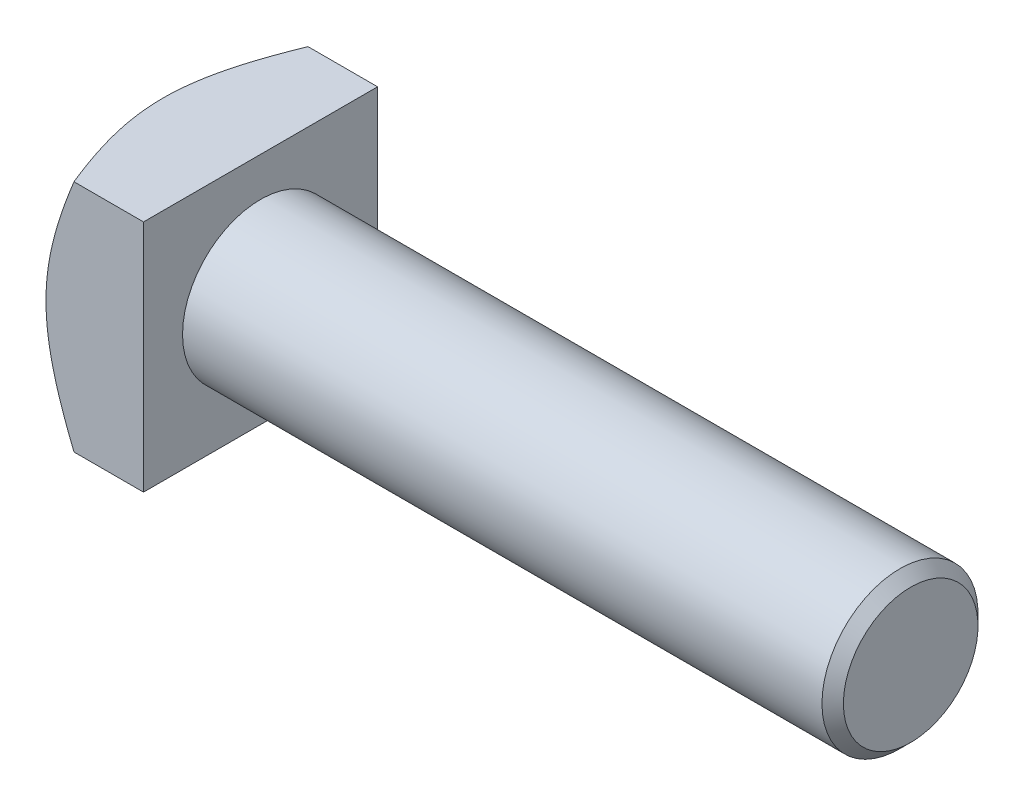
ISO-10303-21;
HEADER;
FILE_DESCRIPTION(('STEP AP214'),'2;1');
FILE_NAME('part.step','',(''),(''),'','','');
FILE_SCHEMA(('AUTOMOTIVE_DESIGN { 1 0 10303 214 1 1 1 1 }'));
ENDSEC;
DATA;
#1=APPLICATION_CONTEXT('core data for automotive mechanical design processes');
#2=APPLICATION_PROTOCOL_DEFINITION('international standard','automotive_design',2000,#1);
#3=PRODUCT_CONTEXT('',#1,'mechanical');
#4=PRODUCT('Part','Part','',(#3));
#5=PRODUCT_RELATED_PRODUCT_CATEGORY('part','',(#4));
#6=PRODUCT_DEFINITION_FORMATION('','',#4);
#7=PRODUCT_DEFINITION_CONTEXT('part definition',#1,'design');
#8=PRODUCT_DEFINITION('design','',#6,#7);
#9=PRODUCT_DEFINITION_SHAPE('','',#8);
#10=(LENGTH_UNIT() NAMED_UNIT(*) SI_UNIT(.MILLI.,.METRE.));
#11=(NAMED_UNIT(*) PLANE_ANGLE_UNIT() SI_UNIT($,.RADIAN.));
#12=(NAMED_UNIT(*) SI_UNIT($,.STERADIAN.) SOLID_ANGLE_UNIT());
#13=UNCERTAINTY_MEASURE_WITH_UNIT(LENGTH_MEASURE(1.E-05),#10,'distance_accuracy_value','');
#14=(GEOMETRIC_REPRESENTATION_CONTEXT(3) GLOBAL_UNCERTAINTY_ASSIGNED_CONTEXT((#13)) GLOBAL_UNIT_ASSIGNED_CONTEXT((#10,
#11,#12)) REPRESENTATION_CONTEXT('',''));
#15=CARTESIAN_POINT('',(0.,0.,0.));
#16=DIRECTION('',(0.,0.,1.));
#17=DIRECTION('',(1.,0.,0.));
#18=AXIS2_PLACEMENT_3D('',#15,#16,#17);
#19=CARTESIAN_POINT('',(15.,18.,18.));
#20=DIRECTION('',(0.,-1.,0.));
#21=DIRECTION('',(0.,0.,-1.));
#22=AXIS2_PLACEMENT_3D('',#19,#20,#21);
#23=PLANE('',#22);
#24=CARTESIAN_POINT('',(12.6143495053669,18.,-35.5516305286949));
#25=CARTESIAN_POINT('',(12.3897251010983,18.,-35.115539618065));
#26=CARTESIAN_POINT('',(12.1657628849431,18.,-34.6791077432139));
#27=CARTESIAN_POINT('',(11.7193055734246,18.,-33.8054922618849));
#28=CARTESIAN_POINT('',(11.4968104835666,18.,-33.3683086525939));
#29=CARTESIAN_POINT('',(10.8317168678324,18.,-32.0554797481633));
#30=CARTESIAN_POINT('',(10.3915360437425,18.,-31.1786068661556));
#31=CARTESIAN_POINT('',(9.51805366831173,18.,-29.418865000001));
#32=CARTESIAN_POINT('',(9.08477073286862,18.,-28.5359867636291));
#33=CARTESIAN_POINT('',(8.22808345051656,18.,-26.7654622313978));
#34=CARTESIAN_POINT('',(7.80467890117688,18.,-25.8778160337042));
#35=CARTESIAN_POINT('',(6.94713470636354,18.,-24.047257867529));
#36=CARTESIAN_POINT('',(6.51370370715972,18.,-23.1040131219224));
#37=CARTESIAN_POINT('',(5.66469197919541,18.,-21.2094066351981));
#38=CARTESIAN_POINT('',(5.24911226702919,18.,-20.2580444354961));
#39=CARTESIAN_POINT('',(4.64359961317925,18.,-18.8239444061262));
#40=CARTESIAN_POINT('',(4.44481871620861,18.,-18.3449395280289));
#41=CARTESIAN_POINT('',(4.05406467399005,18.,-17.3841648698375));
#42=CARTESIAN_POINT('',(3.86209139976695,18.,-16.9023951423264));
#43=CARTESIAN_POINT('',(3.48601609409659,18.,-15.9358345402623));
#44=CARTESIAN_POINT('',(3.3019133883153,18.,-15.4510439286265));
#45=CARTESIAN_POINT('',(2.942809203375,18.,-14.4781126066897));
#46=CARTESIAN_POINT('',(2.76780742093217,18.,-13.9899720086398));
#47=CARTESIAN_POINT('',(2.43022293276174,18.,-13.0154491134993));
#48=CARTESIAN_POINT('',(2.26752424345131,18.,-12.5291071182064));
#49=CARTESIAN_POINT('',(1.95406621275443,18.,-11.5526315521246));
#50=CARTESIAN_POINT('',(1.80330563572228,18.,-11.0624983795182));
#51=CARTESIAN_POINT('',(1.51554251424159,18.,-10.0782215664482));
#52=CARTESIAN_POINT('',(1.37853919694763,18.,-9.58407815295648));
#53=CARTESIAN_POINT('',(1.12025875918787,18.,-8.59148827485595));
#54=CARTESIAN_POINT('',(0.998987235776922,18.,-8.0930403456905));
#55=CARTESIAN_POINT('',(0.776567157071605,18.,-7.10179734819109));
#56=CARTESIAN_POINT('',(0.675074043256583,18.,-6.60908004579901));
#57=CARTESIAN_POINT('',(0.491413063402408,18.,-5.62006349928108));
#58=CARTESIAN_POINT('',(0.409243991665247,18.,-5.12376448062423));
#59=CARTESIAN_POINT('',(0.266179824556192,18.,-4.12821447312217));
#60=CARTESIAN_POINT('',(0.20527920862672,18.,-3.62896428456471));
#61=CARTESIAN_POINT('',(0.106341002701312,18.,-2.6282514102753));
#62=CARTESIAN_POINT('',(0.0683007802740041,18.,-2.12678898598942));
#63=CARTESIAN_POINT('',(0.0107702991343694,18.,-1.01808181611608));
#64=CARTESIAN_POINT('',(-0.00321223204766683,18.,-0.410540279977817));
#65=CARTESIAN_POINT('',(0.00445510403440826,18.,0.80424101729076));
#66=CARTESIAN_POINT('',(0.0261013448752838,18.,1.41148080284163));
#67=CARTESIAN_POINT('',(0.104069038651566,18.,2.62387258827997));
#68=CARTESIAN_POINT('',(0.160400101994653,18.,3.22902396276591));
#69=CARTESIAN_POINT('',(0.305431121314957,18.,4.43542103757531));
#70=CARTESIAN_POINT('',(0.394132976035391,18.,5.03666650668775));
#71=CARTESIAN_POINT('',(0.603510431361071,18.,6.25049011033862));
#72=CARTESIAN_POINT('',(0.724995719684985,18.,6.86292720866937));
#73=CARTESIAN_POINT('',(0.994802778845144,18.,8.08180978707323));
#74=CARTESIAN_POINT('',(1.14312501127827,18.,8.68825516389916));
#75=CARTESIAN_POINT('',(1.46277628116274,18.,9.89528627283445));
#76=CARTESIAN_POINT('',(1.63411490117905,18.,10.4958694519788));
#77=CARTESIAN_POINT('',(1.90565295846037,18.,11.3922751632477));
#78=CARTESIAN_POINT('',(1.99858593931542,18.,11.690328112117));
#79=CARTESIAN_POINT('',(2.18890137378243,18.,12.2850110162616));
#80=CARTESIAN_POINT('',(2.28628382394043,18.,12.5816409726413));
#81=CARTESIAN_POINT('',(2.57152114150178,18.,13.4307441525187));
#82=CARTESIAN_POINT('',(2.76444936754336,18.,13.9815162737389));
#83=CARTESIAN_POINT('',(3.16234165322398,18.,15.0787105650516));
#84=CARTESIAN_POINT('',(3.36730646216163,18.,15.6251324619255));
#85=CARTESIAN_POINT('',(3.78748333301799,18.,16.7141645483704));
#86=CARTESIAN_POINT('',(4.00269785995724,18.,17.2567737846367));
#87=CARTESIAN_POINT('',(4.44178936845121,18.,18.338455111147));
#88=CARTESIAN_POINT('',(4.66566618746844,18.,18.8775272675384));
#89=CARTESIAN_POINT('',(5.12102903604248,18.,19.9530541418139));
#90=CARTESIAN_POINT('',(5.35252218156129,18.,20.4895058412696));
#91=CARTESIAN_POINT('',(5.82184966767355,18.,21.5596261739562));
#92=CARTESIAN_POINT('',(6.05968403343864,18.,22.0932947961296));
#93=CARTESIAN_POINT('',(6.54077638149384,18.,23.1580998553862));
#94=CARTESIAN_POINT('',(6.78403369413207,18.,23.6892365953938));
#95=CARTESIAN_POINT('',(7.2752670122817,18.,24.749325267141));
#96=CARTESIAN_POINT('',(7.52324305358088,18.,25.2782771822735));
#97=CARTESIAN_POINT('',(8.2749665340986,18.,26.8657685758891));
#98=CARTESIAN_POINT('',(8.78489090871228,18.,27.9213844627713));
#99=CARTESIAN_POINT('',(9.81727493135286,18.,30.026473652388));
#100=CARTESIAN_POINT('',(10.3397348588647,18.,31.0759468175181));
#101=CARTESIAN_POINT('',(11.3941345334135,18.,33.1693891305556));
#102=CARTESIAN_POINT('',(11.9260689027463,18.,34.2133609906979));
#103=CARTESIAN_POINT('',(12.9976573842896,18.,36.2973185805467));
#104=CARTESIAN_POINT('',(13.537311433356,18.,37.3373043427699));
#105=CARTESIAN_POINT('',(14.5497453828124,18.,39.2742023517141));
#106=CARTESIAN_POINT('',(15.0217450678574,18.,40.1715228878296));
#107=CARTESIAN_POINT('',(15.9696412547966,18.,41.9641045193076));
#108=CARTESIAN_POINT('',(16.4455377639267,18.,42.8593656108421));
#109=CARTESIAN_POINT('',(17.4006926176237,18.,44.6482686913005));
#110=CARTESIAN_POINT('',(17.8799514680775,18.,45.5419104099744));
#111=CARTESIAN_POINT('',(18.8412702982797,18.,47.3276860936507));
#112=CARTESIAN_POINT('',(19.3233302797649,18.,48.2198200577177));
#113=CARTESIAN_POINT('',(20.2865567589267,18.,49.9967045715324));
#114=CARTESIAN_POINT('',(20.767706924514,18.,50.8814639776041));
#115=CARTESIAN_POINT('',(21.7320575897193,18.,52.6498648826894));
#116=CARTESIAN_POINT('',(22.2152580901552,18.,53.5335063812568));
#117=CARTESIAN_POINT('',(23.1833545317845,18.,55.2996537649902));
#118=CARTESIAN_POINT('',(23.6682501533269,18.,56.1821598254184));
#119=CARTESIAN_POINT('',(24.6396074970564,18.,57.9463078322627));
#120=CARTESIAN_POINT('',(25.126069216673,18.,58.8279497800939));
#121=CARTESIAN_POINT('',(25.6132070159929,18.,59.7092174894766));
#122=B_SPLINE_CURVE_WITH_KNOTS('',3,(#24,#25,#26,#27,#28,#29,#30,#31,#32,#33,#34,#35,#36,#37,
#38,#39,#40,#41,#42,#43,#44,#45,#46,#47,#48,#49,#50,#51,#52,#53,#54,#55,#56,#57,#58,#59,#60,#61,
#62,#63,#64,#65,#66,#67,#68,#69,#70,#71,#72,#73,#74,#75,#76,#77,#78,#79,#80,#81,#82,#83,#84,#85,
#86,#87,#88,#89,#90,#91,#92,#93,#94,#95,#96,#97,#98,#99,#100,#101,#102,#103,#104,#105,#106,#107,
#108,#109,#110,#111,#112,#113,#114,#115,#116,#117,#118,#119,#120,#121),.UNSPECIFIED.,.F.,.F.,(4,
2,2,2,2,2,2,2,2,2,2,2,2,2,2,2,2,2,2,2,2,2,2,2,2,2,2,2,2,2,2,2,2,2,2,2,2,2,2,2,2,2,2,2,2,2,2,2,
4),(0.,1.47162477714026,2.94325507332042,5.8866861006075,8.83704034411351,11.7873340749177,
14.9013896282033,18.0156222861061,19.5714198884751,21.1271879994033,22.6828225470975,
24.2384052207698,25.7767766996742,27.3149887418549,28.8531143230691,30.3917856461921,
31.9006252377603,33.4093706622892,34.9177241769645,36.425903967669,38.247941457872,
40.0697935060818,41.8921505770497,43.7146145574962,45.5870275544077,47.4594727599858,
49.3326999632495,50.2692875274672,51.2058743646563,52.9564472139002,54.7071291551647,
56.4582342765051,58.2093065563864,59.9620641208158,61.714828643898,63.4673779130238,
65.2199404791295,68.7367939544053,72.2537259122632,75.7687215430782,79.2836884389681,
82.3253401503725,85.3669975110923,88.4091227672806,91.4512499099196,94.4726276670568,
97.4940066296879,100.514843658223,103.535675731216),.UNSPECIFIED.);
#123=CARTESIAN_POINT('',(4.30463361128577,18.,18.));
#124=VERTEX_POINT('',#123);
#125=CARTESIAN_POINT('',(0.,18.,0.));
#126=VERTEX_POINT('',#125);
#127=EDGE_CURVE('E85',#124,#126,#122,.F.);
#128=ORIENTED_EDGE('',*,*,#127,.F.);
#129=DIRECTION('',(-1.,0.,0.));
#130=VECTOR('',#129,1.);
#131=CARTESIAN_POINT('',(15.,18.,18.));
#132=LINE('',#131,#130);
#133=CARTESIAN_POINT('',(15.,18.,18.));
#134=VERTEX_POINT('',#133);
#135=EDGE_CURVE('E171',#134,#124,#132,.T.);
#136=ORIENTED_EDGE('',*,*,#135,.F.);
#137=DIRECTION('',(0.,0.,1.));
#138=VECTOR('',#137,1.);
#139=CARTESIAN_POINT('',(15.,18.,18.));
#140=LINE('',#139,#138);
#141=CARTESIAN_POINT('',(15.,18.,-18.));
#142=VERTEX_POINT('',#141);
#143=EDGE_CURVE('E184',#142,#134,#140,.T.);
#144=ORIENTED_EDGE('',*,*,#143,.F.);
#145=DIRECTION('',(-1.,0.,0.));
#146=VECTOR('',#145,1.);
#147=CARTESIAN_POINT('',(15.,18.,-18.));
#148=LINE('',#147,#146);
#149=CARTESIAN_POINT('',(4.30463361128577,18.,-18.));
#150=VERTEX_POINT('',#149);
#151=EDGE_CURVE('E110',#142,#150,#148,.T.);
#152=ORIENTED_EDGE('',*,*,#151,.T.);
#153=EDGE_CURVE('E94',#126,#150,#122,.F.);
#154=ORIENTED_EDGE('',*,*,#153,.F.);
#155=EDGE_LOOP('',(#128,#136,#144,#152,#154));
#156=FACE_BOUND('',#155,.T.);
#157=ADVANCED_FACE('F34',(#156),#23,.F.);
#158=CARTESIAN_POINT('',(15.,18.,18.));
#159=DIRECTION('',(0.,0.,-1.));
#160=DIRECTION('',(0.,1.,0.));
#161=AXIS2_PLACEMENT_3D('',#158,#159,#160);
#162=PLANE('',#161);
#163=CARTESIAN_POINT('',(12.6143495053669,-35.5516305286949,18.));
#164=CARTESIAN_POINT('',(12.3897251010983,-35.115539618065,18.));
#165=CARTESIAN_POINT('',(12.1657628849431,-34.6791077432139,18.));
#166=CARTESIAN_POINT('',(11.7193055734246,-33.8054922618849,18.));
#167=CARTESIAN_POINT('',(11.4968104835666,-33.3683086525939,18.));
#168=CARTESIAN_POINT('',(10.8317168678324,-32.0554797481633,18.));
#169=CARTESIAN_POINT('',(10.3915360437425,-31.1786068661556,18.));
#170=CARTESIAN_POINT('',(9.51805366831173,-29.418865000001,18.));
#171=CARTESIAN_POINT('',(9.08477073286862,-28.5359867636291,18.));
#172=CARTESIAN_POINT('',(8.22808345051656,-26.7654622313978,18.));
#173=CARTESIAN_POINT('',(7.80467890117688,-25.8778160337042,18.));
#174=CARTESIAN_POINT('',(6.94713470636354,-24.047257867529,18.));
#175=CARTESIAN_POINT('',(6.51370370715972,-23.1040131219224,18.));
#176=CARTESIAN_POINT('',(5.66469197919542,-21.2094066351981,18.));
#177=CARTESIAN_POINT('',(5.24911226702919,-20.2580444354962,18.));
#178=CARTESIAN_POINT('',(4.64359961317926,-18.8239444061262,18.));
#179=CARTESIAN_POINT('',(4.44481871620861,-18.3449395280289,18.));
#180=CARTESIAN_POINT('',(4.05406467399005,-17.3841648698375,18.));
#181=CARTESIAN_POINT('',(3.86209139976695,-16.9023951423264,18.));
#182=CARTESIAN_POINT('',(3.48601609409659,-15.9358345402623,18.));
#183=CARTESIAN_POINT('',(3.3019133883153,-15.4510439286265,18.));
#184=CARTESIAN_POINT('',(2.942809203375,-14.4781126066897,18.));
#185=CARTESIAN_POINT('',(2.76780742093218,-13.9899720086398,18.));
#186=CARTESIAN_POINT('',(2.43022293276174,-13.0154491134993,18.));
#187=CARTESIAN_POINT('',(2.26752424345131,-12.5291071182064,18.));
#188=CARTESIAN_POINT('',(1.95406621275443,-11.5526315521246,18.));
#189=CARTESIAN_POINT('',(1.80330563572228,-11.0624983795182,18.));
#190=CARTESIAN_POINT('',(1.51554251424159,-10.0782215664483,18.));
#191=CARTESIAN_POINT('',(1.37853919694763,-9.58407815295648,18.));
#192=CARTESIAN_POINT('',(1.12025875918787,-8.59148827485595,18.));
#193=CARTESIAN_POINT('',(0.998987235776921,-8.0930403456905,18.));
#194=CARTESIAN_POINT('',(0.776567157071604,-7.10179734819109,18.));
#195=CARTESIAN_POINT('',(0.675074043256583,-6.60908004579901,18.));
#196=CARTESIAN_POINT('',(0.491413063402409,-5.62006349928108,18.));
#197=CARTESIAN_POINT('',(0.409243991665247,-5.12376448062423,18.));
#198=CARTESIAN_POINT('',(0.266179824556193,-4.12821447312218,18.));
#199=CARTESIAN_POINT('',(0.205279208626722,-3.62896428456471,18.));
#200=CARTESIAN_POINT('',(0.106341002701315,-2.62825141027531,18.));
#201=CARTESIAN_POINT('',(0.0683007802740059,-2.12678898598942,18.));
#202=CARTESIAN_POINT('',(0.0107702991343696,-1.01808181611608,18.));
#203=CARTESIAN_POINT('',(-0.00321223204766781,-0.410540279977822,18.));
#204=CARTESIAN_POINT('',(0.00445510403440729,0.804241017290756,18.));
#205=CARTESIAN_POINT('',(0.0261013448752843,1.41148080284162,18.));
#206=CARTESIAN_POINT('',(0.104069038651568,2.62387258827997,18.));
#207=CARTESIAN_POINT('',(0.160400101994654,3.22902396276591,18.));
#208=CARTESIAN_POINT('',(0.305431121314958,4.43542103757531,18.));
#209=CARTESIAN_POINT('',(0.394132976035393,5.03666650668775,18.));
#210=CARTESIAN_POINT('',(0.603510431361072,6.25049011033862,18.));
#211=CARTESIAN_POINT('',(0.724995719684985,6.86292720866937,18.));
#212=CARTESIAN_POINT('',(0.994802778845143,8.08180978707322,18.));
#213=CARTESIAN_POINT('',(1.14312501127827,8.68825516389915,18.));
#214=CARTESIAN_POINT('',(1.46277628116274,9.89528627283445,18.));
#215=CARTESIAN_POINT('',(1.63411490117905,10.4958694519788,18.));
#216=CARTESIAN_POINT('',(1.90565295846037,11.3922751632477,18.));
#217=CARTESIAN_POINT('',(1.99858593931542,11.690328112117,18.));
#218=CARTESIAN_POINT('',(2.18890137378243,12.2850110162615,18.));
#219=CARTESIAN_POINT('',(2.28628382394043,12.5816409726413,18.));
#220=CARTESIAN_POINT('',(2.57152114150178,13.4307441525187,18.));
#221=CARTESIAN_POINT('',(2.76444936754336,13.9815162737389,18.));
#222=CARTESIAN_POINT('',(3.16234165322398,15.0787105650516,18.));
#223=CARTESIAN_POINT('',(3.36730646216163,15.6251324619255,18.));
#224=CARTESIAN_POINT('',(3.78748333301799,16.7141645483704,18.));
#225=CARTESIAN_POINT('',(4.00269785995724,17.2567737846367,18.));
#226=CARTESIAN_POINT('',(4.44178936845121,18.338455111147,18.));
#227=CARTESIAN_POINT('',(4.66566618746844,18.8775272675384,18.));
#228=CARTESIAN_POINT('',(5.12102903604248,19.9530541418139,18.));
#229=CARTESIAN_POINT('',(5.35252218156129,20.4895058412696,18.));
#230=CARTESIAN_POINT('',(5.82184966767355,21.5596261739562,18.));
#231=CARTESIAN_POINT('',(6.05968403343864,22.0932947961296,18.));
#232=CARTESIAN_POINT('',(6.54077638149384,23.1580998553862,18.));
#233=CARTESIAN_POINT('',(6.78403369413207,23.6892365953938,18.));
#234=CARTESIAN_POINT('',(7.27526701228171,24.749325267141,18.));
#235=CARTESIAN_POINT('',(7.52324305358088,25.2782771822735,18.));
#236=CARTESIAN_POINT('',(8.2749665340986,26.8657685758891,18.));
#237=CARTESIAN_POINT('',(8.78489090871227,27.9213844627713,18.));
#238=CARTESIAN_POINT('',(9.81727493135286,30.026473652388,18.));
#239=CARTESIAN_POINT('',(10.3397348588647,31.0759468175181,18.));
#240=CARTESIAN_POINT('',(11.3941345334135,33.1693891305555,18.));
#241=CARTESIAN_POINT('',(11.9260689027463,34.2133609906978,18.));
#242=CARTESIAN_POINT('',(12.9976573842896,36.2973185805467,18.));
#243=CARTESIAN_POINT('',(13.537311433356,37.3373043427699,18.));
#244=CARTESIAN_POINT('',(14.5497453828124,39.2742023517141,18.));
#245=CARTESIAN_POINT('',(15.0217450678574,40.1715228878296,18.));
#246=CARTESIAN_POINT('',(15.9696412547966,41.9641045193077,18.));
#247=CARTESIAN_POINT('',(16.4455377639267,42.8593656108421,18.));
#248=CARTESIAN_POINT('',(17.4006926176237,44.6482686913006,18.));
#249=CARTESIAN_POINT('',(17.8799514680775,45.5419104099744,18.));
#250=CARTESIAN_POINT('',(18.8412702982797,47.3276860936507,18.));
#251=CARTESIAN_POINT('',(19.3233302797649,48.2198200577177,18.));
#252=CARTESIAN_POINT('',(20.2865567589267,49.9967045715324,18.));
#253=CARTESIAN_POINT('',(20.767706924514,50.8814639776041,18.));
#254=CARTESIAN_POINT('',(21.7320575897193,52.6498648826894,18.));
#255=CARTESIAN_POINT('',(22.2152580901552,53.5335063812568,18.));
#256=CARTESIAN_POINT('',(23.1833545317845,55.2996537649902,18.));
#257=CARTESIAN_POINT('',(23.6682501533269,56.1821598254185,18.));
#258=CARTESIAN_POINT('',(24.6396074970564,57.9463078322627,18.));
#259=CARTESIAN_POINT('',(25.126069216673,58.8279497800939,18.));
#260=CARTESIAN_POINT('',(25.6132070159929,59.7092174894766,18.));
#261=B_SPLINE_CURVE_WITH_KNOTS('',3,(#163,#164,#165,#166,#167,#168,#169,#170,#171,#172,#173,
#174,#175,#176,#177,#178,#179,#180,#181,#182,#183,#184,#185,#186,#187,#188,#189,#190,#191,#192,
#193,#194,#195,#196,#197,#198,#199,#200,#201,#202,#203,#204,#205,#206,#207,#208,#209,#210,#211,
#212,#213,#214,#215,#216,#217,#218,#219,#220,#221,#222,#223,#224,#225,#226,#227,#228,#229,#230,
#231,#232,#233,#234,#235,#236,#237,#238,#239,#240,#241,#242,#243,#244,#245,#246,#247,#248,#249,
#250,#251,#252,#253,#254,#255,#256,#257,#258,#259,#260),.UNSPECIFIED.,.F.,.F.,(4,2,2,2,2,2,2,2,
2,2,2,2,2,2,2,2,2,2,2,2,2,2,2,2,2,2,2,2,2,2,2,2,2,2,2,2,2,2,2,2,2,2,2,2,2,2,2,2,4),(0.,
1.47162477714026,2.94325507332042,5.8866861006075,8.83704034411351,11.7873340749177,
14.9013896282033,18.0156222861061,19.5714198884751,21.1271879994033,22.6828225470975,
24.2384052207698,25.7767766996742,27.3149887418549,28.8531143230691,30.3917856461921,
31.9006252377603,33.4093706622892,34.9177241769645,36.425903967669,38.247941457872,
40.0697935060818,41.8921505770497,43.7146145574962,45.5870275544077,47.4594727599858,
49.3326999632495,50.2692875274672,51.2058743646563,52.9564472139002,54.7071291551647,
56.4582342765051,58.2093065563864,59.9620641208157,61.714828643898,63.4673779130238,
65.2199404791295,68.7367939544053,72.2537259122632,75.7687215430782,79.2836884389681,
82.3253401503725,85.3669975110923,88.4091227672806,91.4512499099196,94.4726276670568,
97.4940066296879,100.514843658223,103.535675731216),.UNSPECIFIED.);
#262=CARTESIAN_POINT('',(4.30463361128577,-18.,18.));
#263=VERTEX_POINT('',#262);
#264=CARTESIAN_POINT('',(0.,0.,18.));
#265=VERTEX_POINT('',#264);
#266=EDGE_CURVE('E162',#263,#265,#261,.T.);
#267=ORIENTED_EDGE('',*,*,#266,.F.);
#268=DIRECTION('',(-1.,0.,0.));
#269=VECTOR('',#268,1.);
#270=CARTESIAN_POINT('',(15.,-18.,18.));
#271=LINE('',#270,#269);
#272=CARTESIAN_POINT('',(15.,-18.,18.));
#273=VERTEX_POINT('',#272);
#274=EDGE_CURVE('E164',#273,#263,#271,.T.);
#275=ORIENTED_EDGE('',*,*,#274,.F.);
#276=DIRECTION('',(0.,-1.,0.));
#277=VECTOR('',#276,1.);
#278=CARTESIAN_POINT('',(15.,18.,18.));
#279=LINE('',#278,#277);
#280=EDGE_CURVE('E182',#134,#273,#279,.T.);
#281=ORIENTED_EDGE('',*,*,#280,.F.);
#282=ORIENTED_EDGE('',*,*,#135,.T.);
#283=EDGE_CURVE('E88',#265,#124,#261,.T.);
#284=ORIENTED_EDGE('',*,*,#283,.F.);
#285=EDGE_LOOP('',(#267,#275,#281,#282,#284));
#286=FACE_BOUND('',#285,.T.);
#287=ADVANCED_FACE('F152',(#286),#162,.F.);
#288=CARTESIAN_POINT('',(15.,-18.,18.));
#289=DIRECTION('',(0.,1.,0.));
#290=DIRECTION('',(0.,0.,1.));
#291=AXIS2_PLACEMENT_3D('',#288,#289,#290);
#292=PLANE('',#291);
#293=CARTESIAN_POINT('',(12.6143495053669,-18.,-35.5516305286949));
#294=CARTESIAN_POINT('',(12.3897251010983,-18.,-35.115539618065));
#295=CARTESIAN_POINT('',(12.1657628849431,-18.,-34.6791077432139));
#296=CARTESIAN_POINT('',(11.7193055734246,-18.,-33.8054922618849));
#297=CARTESIAN_POINT('',(11.4968104835666,-18.,-33.3683086525939));
#298=CARTESIAN_POINT('',(10.8317168678324,-18.,-32.0554797481633));
#299=CARTESIAN_POINT('',(10.3915360437425,-18.,-31.1786068661556));
#300=CARTESIAN_POINT('',(9.51805366831173,-18.,-29.418865000001));
#301=CARTESIAN_POINT('',(9.08477073286862,-18.,-28.5359867636291));
#302=CARTESIAN_POINT('',(8.22808345051656,-18.,-26.7654622313978));
#303=CARTESIAN_POINT('',(7.80467890117688,-18.,-25.8778160337042));
#304=CARTESIAN_POINT('',(6.94713470636354,-18.,-24.047257867529));
#305=CARTESIAN_POINT('',(6.51370370715972,-18.,-23.1040131219224));
#306=CARTESIAN_POINT('',(5.66469197919541,-18.,-21.2094066351981));
#307=CARTESIAN_POINT('',(5.24911226702919,-18.,-20.2580444354961));
#308=CARTESIAN_POINT('',(4.64359961317925,-18.,-18.8239444061262));
#309=CARTESIAN_POINT('',(4.44481871620861,-18.,-18.3449395280289));
#310=CARTESIAN_POINT('',(4.05406467399005,-18.,-17.3841648698375));
#311=CARTESIAN_POINT('',(3.86209139976695,-18.,-16.9023951423264));
#312=CARTESIAN_POINT('',(3.48601609409659,-18.,-15.9358345402623));
#313=CARTESIAN_POINT('',(3.3019133883153,-18.,-15.4510439286265));
#314=CARTESIAN_POINT('',(2.942809203375,-18.,-14.4781126066897));
#315=CARTESIAN_POINT('',(2.76780742093217,-18.,-13.9899720086398));
#316=CARTESIAN_POINT('',(2.43022293276174,-18.,-13.0154491134993));
#317=CARTESIAN_POINT('',(2.26752424345131,-18.,-12.5291071182064));
#318=CARTESIAN_POINT('',(1.95406621275443,-18.,-11.5526315521246));
#319=CARTESIAN_POINT('',(1.80330563572228,-18.,-11.0624983795182));
#320=CARTESIAN_POINT('',(1.51554251424159,-18.,-10.0782215664482));
#321=CARTESIAN_POINT('',(1.37853919694763,-18.,-9.58407815295648));
#322=CARTESIAN_POINT('',(1.12025875918787,-18.,-8.59148827485595));
#323=CARTESIAN_POINT('',(0.998987235776922,-18.,-8.0930403456905));
#324=CARTESIAN_POINT('',(0.776567157071605,-18.,-7.10179734819109));
#325=CARTESIAN_POINT('',(0.675074043256583,-18.,-6.60908004579901));
#326=CARTESIAN_POINT('',(0.491413063402408,-18.,-5.62006349928108));
#327=CARTESIAN_POINT('',(0.409243991665247,-18.,-5.12376448062423));
#328=CARTESIAN_POINT('',(0.266179824556192,-18.,-4.12821447312217));
#329=CARTESIAN_POINT('',(0.20527920862672,-18.,-3.62896428456471));
#330=CARTESIAN_POINT('',(0.106341002701312,-18.,-2.6282514102753));
#331=CARTESIAN_POINT('',(0.0683007802740041,-18.,-2.12678898598942));
#332=CARTESIAN_POINT('',(0.0107702991343694,-18.,-1.01808181611608));
#333=CARTESIAN_POINT('',(-0.00321223204766683,-18.,-0.410540279977817));
#334=CARTESIAN_POINT('',(0.00445510403440826,-18.,0.80424101729076));
#335=CARTESIAN_POINT('',(0.0261013448752838,-18.,1.41148080284163));
#336=CARTESIAN_POINT('',(0.104069038651566,-18.,2.62387258827997));
#337=CARTESIAN_POINT('',(0.160400101994653,-18.,3.22902396276591));
#338=CARTESIAN_POINT('',(0.305431121314957,-18.,4.43542103757531));
#339=CARTESIAN_POINT('',(0.394132976035391,-18.,5.03666650668775));
#340=CARTESIAN_POINT('',(0.603510431361071,-18.,6.25049011033862));
#341=CARTESIAN_POINT('',(0.724995719684985,-18.,6.86292720866937));
#342=CARTESIAN_POINT('',(0.994802778845144,-18.,8.08180978707323));
#343=CARTESIAN_POINT('',(1.14312501127827,-18.,8.68825516389916));
#344=CARTESIAN_POINT('',(1.46277628116274,-18.,9.89528627283445));
#345=CARTESIAN_POINT('',(1.63411490117905,-18.,10.4958694519788));
#346=CARTESIAN_POINT('',(1.90565295846037,-18.,11.3922751632477));
#347=CARTESIAN_POINT('',(1.99858593931542,-18.,11.690328112117));
#348=CARTESIAN_POINT('',(2.18890137378243,-18.,12.2850110162616));
#349=CARTESIAN_POINT('',(2.28628382394043,-18.,12.5816409726413));
#350=CARTESIAN_POINT('',(2.57152114150178,-18.,13.4307441525187));
#351=CARTESIAN_POINT('',(2.76444936754336,-18.,13.9815162737389));
#352=CARTESIAN_POINT('',(3.16234165322398,-18.,15.0787105650516));
#353=CARTESIAN_POINT('',(3.36730646216163,-18.,15.6251324619255));
#354=CARTESIAN_POINT('',(3.78748333301799,-18.,16.7141645483704));
#355=CARTESIAN_POINT('',(4.00269785995724,-18.,17.2567737846367));
#356=CARTESIAN_POINT('',(4.44178936845121,-18.,18.338455111147));
#357=CARTESIAN_POINT('',(4.66566618746844,-18.,18.8775272675384));
#358=CARTESIAN_POINT('',(5.12102903604248,-18.,19.9530541418139));
#359=CARTESIAN_POINT('',(5.35252218156129,-18.,20.4895058412696));
#360=CARTESIAN_POINT('',(5.82184966767355,-18.,21.5596261739562));
#361=CARTESIAN_POINT('',(6.05968403343864,-18.,22.0932947961296));
#362=CARTESIAN_POINT('',(6.54077638149384,-18.,23.1580998553862));
#363=CARTESIAN_POINT('',(6.78403369413207,-18.,23.6892365953938));
#364=CARTESIAN_POINT('',(7.2752670122817,-18.,24.749325267141));
#365=CARTESIAN_POINT('',(7.52324305358088,-18.,25.2782771822735));
#366=CARTESIAN_POINT('',(8.2749665340986,-18.,26.8657685758891));
#367=CARTESIAN_POINT('',(8.78489090871228,-18.,27.9213844627713));
#368=CARTESIAN_POINT('',(9.81727493135286,-18.,30.026473652388));
#369=CARTESIAN_POINT('',(10.3397348588647,-18.,31.0759468175181));
#370=CARTESIAN_POINT('',(11.3941345334135,-18.,33.1693891305556));
#371=CARTESIAN_POINT('',(11.9260689027463,-18.,34.2133609906979));
#372=CARTESIAN_POINT('',(12.9976573842896,-18.,36.2973185805467));
#373=CARTESIAN_POINT('',(13.537311433356,-18.,37.3373043427699));
#374=CARTESIAN_POINT('',(14.5497453828124,-18.,39.2742023517141));
#375=CARTESIAN_POINT('',(15.0217450678574,-18.,40.1715228878296));
#376=CARTESIAN_POINT('',(15.9696412547966,-18.,41.9641045193076));
#377=CARTESIAN_POINT('',(16.4455377639267,-18.,42.8593656108421));
#378=CARTESIAN_POINT('',(17.4006926176237,-18.,44.6482686913005));
#379=CARTESIAN_POINT('',(17.8799514680775,-18.,45.5419104099744));
#380=CARTESIAN_POINT('',(18.8412702982797,-18.,47.3276860936507));
#381=CARTESIAN_POINT('',(19.3233302797649,-18.,48.2198200577177));
#382=CARTESIAN_POINT('',(20.2865567589267,-18.,49.9967045715324));
#383=CARTESIAN_POINT('',(20.767706924514,-18.,50.8814639776041));
#384=CARTESIAN_POINT('',(21.7320575897193,-18.,52.6498648826894));
#385=CARTESIAN_POINT('',(22.2152580901552,-18.,53.5335063812568));
#386=CARTESIAN_POINT('',(23.1833545317845,-18.,55.2996537649902));
#387=CARTESIAN_POINT('',(23.6682501533269,-18.,56.1821598254184));
#388=CARTESIAN_POINT('',(24.6396074970564,-18.,57.9463078322627));
#389=CARTESIAN_POINT('',(25.126069216673,-18.,58.8279497800939));
#390=CARTESIAN_POINT('',(25.6132070159929,-18.,59.7092174894766));
#391=B_SPLINE_CURVE_WITH_KNOTS('',3,(#293,#294,#295,#296,#297,#298,#299,#300,#301,#302,#303,
#304,#305,#306,#307,#308,#309,#310,#311,#312,#313,#314,#315,#316,#317,#318,#319,#320,#321,#322,
#323,#324,#325,#326,#327,#328,#329,#330,#331,#332,#333,#334,#335,#336,#337,#338,#339,#340,#341,
#342,#343,#344,#345,#346,#347,#348,#349,#350,#351,#352,#353,#354,#355,#356,#357,#358,#359,#360,
#361,#362,#363,#364,#365,#366,#367,#368,#369,#370,#371,#372,#373,#374,#375,#376,#377,#378,#379,
#380,#381,#382,#383,#384,#385,#386,#387,#388,#389,#390),.UNSPECIFIED.,.F.,.F.,(4,2,2,2,2,2,2,2,
2,2,2,2,2,2,2,2,2,2,2,2,2,2,2,2,2,2,2,2,2,2,2,2,2,2,2,2,2,2,2,2,2,2,2,2,2,2,2,2,4),(0.,
1.47162477714026,2.94325507332042,5.8866861006075,8.83704034411351,11.7873340749177,
14.9013896282033,18.0156222861061,19.5714198884751,21.1271879994033,22.6828225470975,
24.2384052207698,25.7767766996742,27.3149887418549,28.8531143230691,30.3917856461921,
31.9006252377603,33.4093706622892,34.9177241769645,36.425903967669,38.247941457872,
40.0697935060818,41.8921505770497,43.7146145574962,45.5870275544077,47.4594727599858,
49.3326999632495,50.2692875274672,51.2058743646563,52.9564472139002,54.7071291551647,
56.4582342765051,58.2093065563864,59.9620641208158,61.714828643898,63.4673779130238,
65.2199404791295,68.7367939544053,72.2537259122632,75.7687215430782,79.2836884389681,
82.3253401503725,85.3669975110923,88.4091227672806,91.4512499099196,94.4726276670568,
97.4940066296879,100.514843658223,103.535675731216),.UNSPECIFIED.);
#392=CARTESIAN_POINT('',(4.30463361128577,-18.,-18.));
#393=VERTEX_POINT('',#392);
#394=CARTESIAN_POINT('',(0.,-18.,0.));
#395=VERTEX_POINT('',#394);
#396=EDGE_CURVE('E111',#393,#395,#391,.T.);
#397=ORIENTED_EDGE('',*,*,#396,.F.);
#398=DIRECTION('',(-1.,0.,0.));
#399=VECTOR('',#398,1.);
#400=CARTESIAN_POINT('',(15.,-18.,-18.));
#401=LINE('',#400,#399);
#402=CARTESIAN_POINT('',(15.,-18.,-18.));
#403=VERTEX_POINT('',#402);
#404=EDGE_CURVE('E172',#403,#393,#401,.T.);
#405=ORIENTED_EDGE('',*,*,#404,.F.);
#406=DIRECTION('',(0.,0.,-1.));
#407=VECTOR('',#406,1.);
#408=CARTESIAN_POINT('',(15.,-18.,18.));
#409=LINE('',#408,#407);
#410=EDGE_CURVE('E170',#273,#403,#409,.T.);
#411=ORIENTED_EDGE('',*,*,#410,.F.);
#412=ORIENTED_EDGE('',*,*,#274,.T.);
#413=EDGE_CURVE('E93',#395,#263,#391,.T.);
#414=ORIENTED_EDGE('',*,*,#413,.F.);
#415=EDGE_LOOP('',(#397,#405,#411,#412,#414));
#416=FACE_BOUND('',#415,.T.);
#417=ADVANCED_FACE('F147',(#416),#292,.F.);
#418=CARTESIAN_POINT('',(15.,18.,-18.));
#419=DIRECTION('',(0.,0.,1.));
#420=DIRECTION('',(1.,0.,0.));
#421=AXIS2_PLACEMENT_3D('',#418,#419,#420);
#422=PLANE('',#421);
#423=CARTESIAN_POINT('',(12.6143495053669,-35.5516305286949,-18.));
#424=CARTESIAN_POINT('',(12.3897251010983,-35.115539618065,-18.));
#425=CARTESIAN_POINT('',(12.1657628849431,-34.6791077432139,-18.));
#426=CARTESIAN_POINT('',(11.7193055734246,-33.8054922618849,-18.));
#427=CARTESIAN_POINT('',(11.4968104835666,-33.3683086525939,-18.));
#428=CARTESIAN_POINT('',(10.8317168678324,-32.0554797481633,-18.));
#429=CARTESIAN_POINT('',(10.3915360437425,-31.1786068661556,-18.));
#430=CARTESIAN_POINT('',(9.51805366831172,-29.418865000001,-18.));
#431=CARTESIAN_POINT('',(9.08477073286862,-28.5359867636291,-18.));
#432=CARTESIAN_POINT('',(8.22808345051655,-26.7654622313978,-18.));
#433=CARTESIAN_POINT('',(7.80467890117688,-25.8778160337042,-18.));
#434=CARTESIAN_POINT('',(6.94713470636354,-24.047257867529,-18.));
#435=CARTESIAN_POINT('',(6.51370370715972,-23.1040131219224,-18.));
#436=CARTESIAN_POINT('',(5.66469197919542,-21.2094066351981,-18.));
#437=CARTESIAN_POINT('',(5.24911226702919,-20.2580444354961,-18.));
#438=CARTESIAN_POINT('',(4.64359961317926,-18.8239444061262,-18.));
#439=CARTESIAN_POINT('',(4.44481871620861,-18.3449395280289,-18.));
#440=CARTESIAN_POINT('',(4.05406467399005,-17.3841648698375,-18.));
#441=CARTESIAN_POINT('',(3.86209139976695,-16.9023951423264,-18.));
#442=CARTESIAN_POINT('',(3.4860160940966,-15.9358345402623,-18.));
#443=CARTESIAN_POINT('',(3.30191338831531,-15.4510439286265,-18.));
#444=CARTESIAN_POINT('',(2.942809203375,-14.4781126066897,-18.));
#445=CARTESIAN_POINT('',(2.76780742093218,-13.9899720086398,-18.));
#446=CARTESIAN_POINT('',(2.43022293276174,-13.0154491134993,-18.));
#447=CARTESIAN_POINT('',(2.26752424345132,-12.5291071182064,-18.));
#448=CARTESIAN_POINT('',(1.95406621275443,-11.5526315521246,-18.));
#449=CARTESIAN_POINT('',(1.80330563572228,-11.0624983795182,-18.));
#450=CARTESIAN_POINT('',(1.51554251424159,-10.0782215664482,-18.));
#451=CARTESIAN_POINT('',(1.37853919694763,-9.58407815295648,-18.));
#452=CARTESIAN_POINT('',(1.12025875918787,-8.59148827485595,-18.));
#453=CARTESIAN_POINT('',(0.99898723577692,-8.0930403456905,-18.));
#454=CARTESIAN_POINT('',(0.776567157071603,-7.10179734819109,-18.));
#455=CARTESIAN_POINT('',(0.67507404325658,-6.60908004579901,-18.));
#456=CARTESIAN_POINT('',(0.491413063402407,-5.62006349928108,-18.));
#457=CARTESIAN_POINT('',(0.409243991665246,-5.12376448062422,-18.));
#458=CARTESIAN_POINT('',(0.266179824556192,-4.12821447312217,-18.));
#459=CARTESIAN_POINT('',(0.20527920862672,-3.62896428456471,-18.));
#460=CARTESIAN_POINT('',(0.106341002701312,-2.6282514102753,-18.));
#461=CARTESIAN_POINT('',(0.0683007802740045,-2.12678898598942,-18.));
#462=CARTESIAN_POINT('',(0.0107702991343691,-1.01808181611608,-18.));
#463=CARTESIAN_POINT('',(-0.00321223204766867,-0.410540279977821,-18.));
#464=CARTESIAN_POINT('',(0.00445510403440612,0.804241017290756,-18.));
#465=CARTESIAN_POINT('',(0.0261013448752831,1.41148080284162,-18.));
#466=CARTESIAN_POINT('',(0.104069038651567,2.62387258827997,-18.));
#467=CARTESIAN_POINT('',(0.160400101994653,3.22902396276591,-18.));
#468=CARTESIAN_POINT('',(0.305431121314956,4.43542103757531,-18.));
#469=CARTESIAN_POINT('',(0.39413297603539,5.03666650668774,-18.));
#470=CARTESIAN_POINT('',(0.603510431361069,6.25049011033861,-18.));
#471=CARTESIAN_POINT('',(0.724995719684983,6.86292720866937,-18.));
#472=CARTESIAN_POINT('',(0.994802778845143,8.08180978707323,-18.));
#473=CARTESIAN_POINT('',(1.14312501127827,8.68825516389916,-18.));
#474=CARTESIAN_POINT('',(1.46277628116274,9.89528627283445,-18.));
#475=CARTESIAN_POINT('',(1.63411490117905,10.4958694519788,-18.));
#476=CARTESIAN_POINT('',(1.90565295846037,11.3922751632477,-18.));
#477=CARTESIAN_POINT('',(1.99858593931542,11.690328112117,-18.));
#478=CARTESIAN_POINT('',(2.18890137378243,12.2850110162616,-18.));
#479=CARTESIAN_POINT('',(2.28628382394043,12.5816409726413,-18.));
#480=CARTESIAN_POINT('',(2.57152114150178,13.4307441525187,-18.));
#481=CARTESIAN_POINT('',(2.76444936754336,13.9815162737389,-18.));
#482=CARTESIAN_POINT('',(3.16234165322398,15.0787105650517,-18.));
#483=CARTESIAN_POINT('',(3.36730646216163,15.6251324619255,-18.));
#484=CARTESIAN_POINT('',(3.78748333301799,16.7141645483704,-18.));
#485=CARTESIAN_POINT('',(4.00269785995724,17.2567737846367,-18.));
#486=CARTESIAN_POINT('',(4.4417893684512,18.338455111147,-18.));
#487=CARTESIAN_POINT('',(4.66566618746843,18.8775272675384,-18.));
#488=CARTESIAN_POINT('',(5.12102903604247,19.9530541418139,-18.));
#489=CARTESIAN_POINT('',(5.35252218156129,20.4895058412695,-18.));
#490=CARTESIAN_POINT('',(5.82184966767355,21.5596261739562,-18.));
#491=CARTESIAN_POINT('',(6.05968403343864,22.0932947961296,-18.));
#492=CARTESIAN_POINT('',(6.54077638149384,23.1580998553862,-18.));
#493=CARTESIAN_POINT('',(6.78403369413207,23.6892365953938,-18.));
#494=CARTESIAN_POINT('',(7.2752670122817,24.749325267141,-18.));
#495=CARTESIAN_POINT('',(7.52324305358088,25.2782771822735,-18.));
#496=CARTESIAN_POINT('',(8.2749665340986,26.8657685758891,-18.));
#497=CARTESIAN_POINT('',(8.78489090871227,27.9213844627713,-18.));
#498=CARTESIAN_POINT('',(9.81727493135286,30.026473652388,-18.));
#499=CARTESIAN_POINT('',(10.3397348588647,31.0759468175181,-18.));
#500=CARTESIAN_POINT('',(11.3941345334135,33.1693891305556,-18.));
#501=CARTESIAN_POINT('',(11.9260689027463,34.2133609906979,-18.));
#502=CARTESIAN_POINT('',(12.9976573842896,36.2973185805467,-18.));
#503=CARTESIAN_POINT('',(13.537311433356,37.3373043427699,-18.));
#504=CARTESIAN_POINT('',(14.5497453828124,39.2742023517141,-18.));
#505=CARTESIAN_POINT('',(15.0217450678574,40.1715228878296,-18.));
#506=CARTESIAN_POINT('',(15.9696412547966,41.9641045193077,-18.));
#507=CARTESIAN_POINT('',(16.4455377639267,42.8593656108421,-18.));
#508=CARTESIAN_POINT('',(17.4006926176237,44.6482686913006,-18.));
#509=CARTESIAN_POINT('',(17.8799514680775,45.5419104099744,-18.));
#510=CARTESIAN_POINT('',(18.8412702982797,47.3276860936507,-18.));
#511=CARTESIAN_POINT('',(19.3233302797649,48.2198200577177,-18.));
#512=CARTESIAN_POINT('',(20.2865567589267,49.9967045715324,-18.));
#513=CARTESIAN_POINT('',(20.767706924514,50.8814639776041,-18.));
#514=CARTESIAN_POINT('',(21.7320575897193,52.6498648826894,-18.));
#515=CARTESIAN_POINT('',(22.2152580901552,53.5335063812568,-18.));
#516=CARTESIAN_POINT('',(23.1833545317845,55.2996537649902,-18.));
#517=CARTESIAN_POINT('',(23.6682501533269,56.1821598254185,-18.));
#518=CARTESIAN_POINT('',(24.6396074970564,57.9463078322627,-18.));
#519=CARTESIAN_POINT('',(25.126069216673,58.8279497800939,-18.));
#520=CARTESIAN_POINT('',(25.6132070159929,59.7092174894766,-18.));
#521=B_SPLINE_CURVE_WITH_KNOTS('',3,(#423,#424,#425,#426,#427,#428,#429,#430,#431,#432,#433,
#434,#435,#436,#437,#438,#439,#440,#441,#442,#443,#444,#445,#446,#447,#448,#449,#450,#451,#452,
#453,#454,#455,#456,#457,#458,#459,#460,#461,#462,#463,#464,#465,#466,#467,#468,#469,#470,#471,
#472,#473,#474,#475,#476,#477,#478,#479,#480,#481,#482,#483,#484,#485,#486,#487,#488,#489,#490,
#491,#492,#493,#494,#495,#496,#497,#498,#499,#500,#501,#502,#503,#504,#505,#506,#507,#508,#509,
#510,#511,#512,#513,#514,#515,#516,#517,#518,#519,#520),.UNSPECIFIED.,.F.,.F.,(4,2,2,2,2,2,2,2,
2,2,2,2,2,2,2,2,2,2,2,2,2,2,2,2,2,2,2,2,2,2,2,2,2,2,2,2,2,2,2,2,2,2,2,2,2,2,2,2,4),(0.,
1.47162477714026,2.94325507332041,5.8866861006075,8.83704034411351,11.7873340749177,
14.9013896282033,18.0156222861061,19.5714198884751,21.1271879994033,22.6828225470975,
24.2384052207698,25.7767766996742,27.3149887418549,28.8531143230691,30.3917856461921,
31.9006252377603,33.4093706622893,34.9177241769645,36.425903967669,38.247941457872,
40.0697935060818,41.8921505770497,43.7146145574962,45.5870275544077,47.4594727599859,
49.3326999632495,50.2692875274672,51.2058743646563,52.9564472139002,54.7071291551647,
56.4582342765051,58.2093065563864,59.9620641208158,61.7148286438981,63.4673779130238,
65.2199404791295,68.7367939544053,72.2537259122632,75.7687215430782,79.2836884389681,
82.3253401503725,85.3669975110923,88.4091227672806,91.4512499099196,94.4726276670568,
97.4940066296879,100.514843658223,103.535675731216),.UNSPECIFIED.);
#522=CARTESIAN_POINT('',(0.,0.,-18.));
#523=VERTEX_POINT('',#522);
#524=EDGE_CURVE('E100',#150,#523,#521,.F.);
#525=ORIENTED_EDGE('',*,*,#524,.F.);
#526=ORIENTED_EDGE('',*,*,#151,.F.);
#527=DIRECTION('',(0.,1.,0.));
#528=VECTOR('',#527,1.);
#529=CARTESIAN_POINT('',(15.,18.,-18.));
#530=LINE('',#529,#528);
#531=EDGE_CURVE('E179',#403,#142,#530,.T.);
#532=ORIENTED_EDGE('',*,*,#531,.F.);
#533=ORIENTED_EDGE('',*,*,#404,.T.);
#534=EDGE_CURVE('E105',#523,#393,#521,.F.);
#535=ORIENTED_EDGE('',*,*,#534,.F.);
#536=EDGE_LOOP('',(#525,#526,#532,#533,#535));
#537=FACE_BOUND('',#536,.T.);
#538=ADVANCED_FACE('F142',(#537),#422,.F.);
#539=CARTESIAN_POINT('',(15.,18.,-18.));
#540=DIRECTION('',(-1.,0.,0.));
#541=DIRECTION('',(0.,0.,1.));
#542=AXIS2_PLACEMENT_3D('',#539,#540,#541);
#543=PLANE('',#542);
#544=CARTESIAN_POINT('',(15.,0.,0.));
#545=DIRECTION('',(-1.,0.,0.));
#546=DIRECTION('',(0.,0.,1.));
#547=AXIS2_PLACEMENT_3D('',#544,#545,#546);
#548=CIRCLE('',#547,12.);
#549=CARTESIAN_POINT('',(15.,0.,12.));
#550=VERTEX_POINT('',#549);
#551=EDGE_CURVE('E174',#550,#550,#548,.F.);
#552=ORIENTED_EDGE('',*,*,#551,.F.);
#553=EDGE_LOOP('',(#552));
#554=FACE_BOUND('',#553,.T.);
#555=ORIENTED_EDGE('',*,*,#143,.T.);
#556=ORIENTED_EDGE('',*,*,#280,.T.);
#557=ORIENTED_EDGE('',*,*,#410,.T.);
#558=ORIENTED_EDGE('',*,*,#531,.T.);
#559=EDGE_LOOP('',(#555,#556,#557,#558));
#560=FACE_BOUND('',#559,.T.);
#561=ADVANCED_FACE('F146',(#554,#560),#543,.F.);
#562=CARTESIAN_POINT('',(0.,0.,0.));
#563=DIRECTION('',(-1.,0.,0.));
#564=DIRECTION('',(0.,0.,1.));
#565=AXIS2_PLACEMENT_3D('',#562,#563,#564);
#566=CYLINDRICAL_SURFACE('',#565,12.);
#567=CARTESIAN_POINT('',(113.352,0.,0.));
#568=DIRECTION('',(-1.,0.,0.));
#569=DIRECTION('',(0.,0.,1.));
#570=AXIS2_PLACEMENT_3D('',#567,#568,#569);
#571=CIRCLE('',#570,12.);
#572=CARTESIAN_POINT('',(113.352,0.,12.));
#573=VERTEX_POINT('',#572);
#574=EDGE_CURVE('E187',#573,#573,#571,.T.);
#575=ORIENTED_EDGE('',*,*,#574,.T.);
#576=EDGE_LOOP('',(#575));
#577=FACE_BOUND('',#576,.T.);
#578=ORIENTED_EDGE('',*,*,#551,.T.);
#579=EDGE_LOOP('',(#578));
#580=FACE_BOUND('',#579,.T.);
#581=ADVANCED_FACE('F200',(#577,#580),#566,.T.);
#582=CARTESIAN_POINT('',(115.,0.,0.));
#583=DIRECTION('',(-1.,0.,0.));
#584=DIRECTION('',(0.,0.,1.));
#585=AXIS2_PLACEMENT_3D('',#582,#583,#584);
#586=CONICAL_SURFACE('',#585,10.352,0.785398163397441);
#587=ORIENTED_EDGE('',*,*,#574,.F.);
#588=EDGE_LOOP('',(#587));
#589=FACE_BOUND('',#588,.T.);
#590=CARTESIAN_POINT('',(115.,0.,0.));
#591=DIRECTION('',(-1.,0.,0.));
#592=DIRECTION('',(0.,0.,1.));
#593=AXIS2_PLACEMENT_3D('',#590,#591,#592);
#594=CIRCLE('',#593,10.352);
#595=CARTESIAN_POINT('',(115.,0.,10.352));
#596=VERTEX_POINT('',#595);
#597=EDGE_CURVE('E166',#596,#596,#594,.T.);
#598=ORIENTED_EDGE('',*,*,#597,.T.);
#599=EDGE_LOOP('',(#598));
#600=FACE_BOUND('',#599,.T.);
#601=ADVANCED_FACE('F194',(#589,#600),#586,.T.);
#602=CARTESIAN_POINT('',(115.,0.,0.));
#603=DIRECTION('',(-1.,0.,0.));
#604=DIRECTION('',(0.,0.,1.));
#605=AXIS2_PLACEMENT_3D('',#602,#603,#604);
#606=PLANE('',#605);
#607=ORIENTED_EDGE('',*,*,#597,.F.);
#608=EDGE_LOOP('',(#607));
#609=FACE_BOUND('',#608,.T.);
#610=ADVANCED_FACE('F132',(#609),#606,.F.);
#611=CARTESIAN_POINT('',(0.,0.,0.));
#612=DIRECTION('',(1.,0.,0.));
#613=DIRECTION('',(0.,0.,-1.));
#614=AXIS2_PLACEMENT_3D('',#611,#612,#613);
#615=CONICAL_SURFACE('',#614,18.,1.0471975511966);
#616=ORIENTED_EDGE('',*,*,#266,.T.);
#617=CARTESIAN_POINT('',(0.,0.,0.));
#618=DIRECTION('',(-1.,0.,0.));
#619=DIRECTION('',(0.,0.,1.));
#620=AXIS2_PLACEMENT_3D('',#617,#618,#619);
#621=CIRCLE('',#620,18.);
#622=EDGE_CURVE('E38',#395,#265,#621,.T.);
#623=ORIENTED_EDGE('',*,*,#622,.F.);
#624=ORIENTED_EDGE('',*,*,#413,.T.);
#625=EDGE_LOOP('',(#616,#623,#624));
#626=FACE_BOUND('',#625,.T.);
#627=ADVANCED_FACE('F127',(#626),#615,.T.);
#628=ORIENTED_EDGE('',*,*,#396,.T.);
#629=EDGE_CURVE('E43',#523,#395,#621,.T.);
#630=ORIENTED_EDGE('',*,*,#629,.F.);
#631=ORIENTED_EDGE('',*,*,#534,.T.);
#632=EDGE_LOOP('',(#628,#630,#631));
#633=FACE_BOUND('',#632,.T.);
#634=ADVANCED_FACE('F131',(#633),#615,.T.);
#635=ORIENTED_EDGE('',*,*,#153,.T.);
#636=ORIENTED_EDGE('',*,*,#524,.T.);
#637=EDGE_CURVE('E11',#126,#523,#621,.T.);
#638=ORIENTED_EDGE('',*,*,#637,.F.);
#639=EDGE_LOOP('',(#635,#636,#638));
#640=FACE_BOUND('',#639,.T.);
#641=ADVANCED_FACE('F98',(#640),#615,.T.);
#642=ORIENTED_EDGE('',*,*,#283,.T.);
#643=ORIENTED_EDGE('',*,*,#127,.T.);
#644=CARTESIAN_POINT('',(0.,0.,0.));
#645=DIRECTION('',(-1.,0.,0.));
#646=DIRECTION('',(0.,0.,1.));
#647=AXIS2_PLACEMENT_3D('',#644,#645,#646);
#648=CIRCLE('',#647,18.);
#649=EDGE_CURVE('E50',#265,#126,#648,.T.);
#650=ORIENTED_EDGE('',*,*,#649,.F.);
#651=EDGE_LOOP('',(#642,#643,#650));
#652=FACE_BOUND('',#651,.T.);
#653=ADVANCED_FACE('F86',(#652),#615,.T.);
#654=CARTESIAN_POINT('',(0.,18.,-18.));
#655=DIRECTION('',(-1.,0.,0.));
#656=DIRECTION('',(0.,0.,1.));
#657=AXIS2_PLACEMENT_3D('',#654,#655,#656);
#658=PLANE('',#657);
#659=ORIENTED_EDGE('',*,*,#622,.T.);
#660=ORIENTED_EDGE('',*,*,#649,.T.);
#661=ORIENTED_EDGE('',*,*,#637,.T.);
#662=ORIENTED_EDGE('',*,*,#629,.T.);
#663=EDGE_LOOP('',(#659,#660,#661,#662));
#664=FACE_BOUND('',#663,.T.);
#665=ADVANCED_FACE('F103',(#664),#658,.T.);
#666=CLOSED_SHELL('',(#157,#287,#417,#538,#561,#581,#601,#610,#627,#634,#641,#653,#665));
#667=MANIFOLD_SOLID_BREP('B2',#666);
#668=ADVANCED_BREP_SHAPE_REPRESENTATION('',(#18,#667),#14);
#669=SHAPE_DEFINITION_REPRESENTATION(#9,#668);
ENDSEC;
END-ISO-10303-21;
